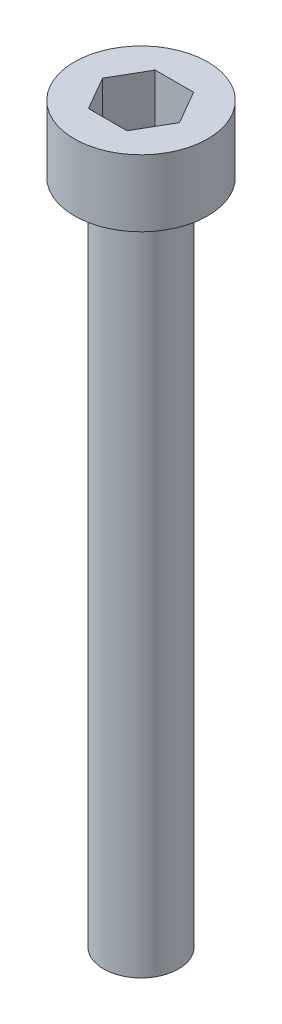
ISO-10303-21;
HEADER;
FILE_DESCRIPTION(('STEP AP214'),'2;1');
FILE_NAME('part.step','',(''),(''),'','','');
FILE_SCHEMA(('AUTOMOTIVE_DESIGN { 1 0 10303 214 1 1 1 1 }'));
ENDSEC;
DATA;
#1=APPLICATION_CONTEXT('core data for automotive mechanical design processes');
#2=APPLICATION_PROTOCOL_DEFINITION('international standard','automotive_design',2000,#1);
#3=PRODUCT_CONTEXT('',#1,'mechanical');
#4=PRODUCT('Part','Part','',(#3));
#5=PRODUCT_RELATED_PRODUCT_CATEGORY('part','',(#4));
#6=PRODUCT_DEFINITION_FORMATION('','',#4);
#7=PRODUCT_DEFINITION_CONTEXT('part definition',#1,'design');
#8=PRODUCT_DEFINITION('design','',#6,#7);
#9=PRODUCT_DEFINITION_SHAPE('','',#8);
#10=(LENGTH_UNIT() NAMED_UNIT(*) SI_UNIT(.MILLI.,.METRE.));
#11=(NAMED_UNIT(*) PLANE_ANGLE_UNIT() SI_UNIT($,.RADIAN.));
#12=(NAMED_UNIT(*) SI_UNIT($,.STERADIAN.) SOLID_ANGLE_UNIT());
#13=UNCERTAINTY_MEASURE_WITH_UNIT(LENGTH_MEASURE(1.E-05),#10,'distance_accuracy_value','');
#14=(GEOMETRIC_REPRESENTATION_CONTEXT(3) GLOBAL_UNCERTAINTY_ASSIGNED_CONTEXT((#13)) GLOBAL_UNIT_ASSIGNED_CONTEXT((#10,
#11,#12)) REPRESENTATION_CONTEXT('',''));
#15=CARTESIAN_POINT('',(0.,0.,0.));
#16=DIRECTION('',(0.,0.,1.));
#17=DIRECTION('',(1.,0.,0.));
#18=AXIS2_PLACEMENT_3D('',#15,#16,#17);
#19=CARTESIAN_POINT('',(0.,-20.,0.));
#20=DIRECTION('',(0.,1.,0.));
#21=DIRECTION('',(0.,0.,1.));
#22=AXIS2_PLACEMENT_3D('',#19,#20,#21);
#23=PLANE('',#22);
#24=CARTESIAN_POINT('',(1.125,-20.,0.));
#25=DIRECTION('',(0.,-1.,0.));
#26=DIRECTION('',(0.,0.,-1.));
#27=AXIS2_PLACEMENT_3D('',#24,#25,#26);
#28=CIRCLE('',#27,2.25);
#29=CARTESIAN_POINT('',(1.125,-20.,-2.25));
#30=VERTEX_POINT('',#29);
#31=EDGE_CURVE('E142',#30,#30,#28,.T.);
#32=ORIENTED_EDGE('',*,*,#31,.T.);
#33=EDGE_LOOP('',(#32));
#34=FACE_BOUND('',#33,.T.);
#35=ADVANCED_FACE('F41',(#34),#23,.F.);
#36=CARTESIAN_POINT('',(0.,24.,0.));
#37=DIRECTION('',(0.,-1.,0.));
#38=DIRECTION('',(0.,0.,-1.));
#39=AXIS2_PLACEMENT_3D('',#36,#37,#38);
#40=PLANE('',#39);
#41=DIRECTION('',(-0.5,0.,-0.866025403784439));
#42=VECTOR('',#41,1.);
#43=CARTESIAN_POINT('',(3.4344010767585,24.,0.));
#44=LINE('',#43,#42);
#45=CARTESIAN_POINT('',(3.4344010767585,24.,0.));
#46=VERTEX_POINT('',#45);
#47=CARTESIAN_POINT('',(2.27970053837925,24.,-2.));
#48=VERTEX_POINT('',#47);
#49=EDGE_CURVE('E129',#46,#48,#44,.T.);
#50=ORIENTED_EDGE('',*,*,#49,.F.);
#51=DIRECTION('',(0.5,0.,-0.866025403784439));
#52=VECTOR('',#51,1.);
#53=CARTESIAN_POINT('',(2.27970053837925,24.,2.));
#54=LINE('',#53,#52);
#55=CARTESIAN_POINT('',(2.27970053837925,24.,2.));
#56=VERTEX_POINT('',#55);
#57=EDGE_CURVE('E55',#56,#46,#54,.T.);
#58=ORIENTED_EDGE('',*,*,#57,.F.);
#59=DIRECTION('',(1.,0.,0.));
#60=VECTOR('',#59,1.);
#61=CARTESIAN_POINT('',(-0.0297005383792518,24.,2.));
#62=LINE('',#61,#60);
#63=CARTESIAN_POINT('',(-0.0297005383792518,24.,2.));
#64=VERTEX_POINT('',#63);
#65=EDGE_CURVE('E138',#64,#56,#62,.T.);
#66=ORIENTED_EDGE('',*,*,#65,.F.);
#67=DIRECTION('',(0.5,0.,0.866025403784439));
#68=VECTOR('',#67,1.);
#69=CARTESIAN_POINT('',(-1.1844010767585,24.,0.));
#70=LINE('',#69,#68);
#71=CARTESIAN_POINT('',(-1.1844010767585,24.,0.));
#72=VERTEX_POINT('',#71);
#73=EDGE_CURVE('E136',#72,#64,#70,.T.);
#74=ORIENTED_EDGE('',*,*,#73,.F.);
#75=DIRECTION('',(-0.5,0.,0.866025403784439));
#76=VECTOR('',#75,1.);
#77=CARTESIAN_POINT('',(-0.0297005383792528,24.,-2.));
#78=LINE('',#77,#76);
#79=CARTESIAN_POINT('',(-0.0297005383792528,24.,-2.));
#80=VERTEX_POINT('',#79);
#81=EDGE_CURVE('E103',#80,#72,#78,.T.);
#82=ORIENTED_EDGE('',*,*,#81,.F.);
#83=DIRECTION('',(-1.,0.,0.));
#84=VECTOR('',#83,1.);
#85=CARTESIAN_POINT('',(2.27970053837925,24.,-2.));
#86=LINE('',#85,#84);
#87=EDGE_CURVE('E132',#48,#80,#86,.T.);
#88=ORIENTED_EDGE('',*,*,#87,.F.);
#89=EDGE_LOOP('',(#50,#58,#66,#74,#82,#88));
#90=FACE_BOUND('',#89,.T.);
#91=CARTESIAN_POINT('',(1.125,24.,0.));
#92=DIRECTION('',(0.,-1.,0.));
#93=DIRECTION('',(0.,0.,-1.));
#94=AXIS2_PLACEMENT_3D('',#91,#92,#93);
#95=CIRCLE('',#94,4.);
#96=CARTESIAN_POINT('',(1.125,24.,-4.));
#97=VERTEX_POINT('',#96);
#98=EDGE_CURVE('E11',#97,#97,#95,.T.);
#99=ORIENTED_EDGE('',*,*,#98,.F.);
#100=EDGE_LOOP('',(#99));
#101=FACE_BOUND('',#100,.T.);
#102=ADVANCED_FACE('F160',(#90,#101),#40,.F.);
#103=CARTESIAN_POINT('',(1.125,-20.,0.));
#104=DIRECTION('',(0.,-1.,0.));
#105=DIRECTION('',(0.,0.,-1.));
#106=AXIS2_PLACEMENT_3D('',#103,#104,#105);
#107=CYLINDRICAL_SURFACE('',#106,4.);
#108=ORIENTED_EDGE('',*,*,#98,.T.);
#109=EDGE_LOOP('',(#108));
#110=FACE_BOUND('',#109,.T.);
#111=CARTESIAN_POINT('',(1.125,20.,0.));
#112=DIRECTION('',(0.,-1.,0.));
#113=DIRECTION('',(0.,0.,-1.));
#114=AXIS2_PLACEMENT_3D('',#111,#112,#113);
#115=CIRCLE('',#114,4.);
#116=CARTESIAN_POINT('',(1.125,20.,-4.));
#117=VERTEX_POINT('',#116);
#118=EDGE_CURVE('E48',#117,#117,#115,.T.);
#119=ORIENTED_EDGE('',*,*,#118,.F.);
#120=EDGE_LOOP('',(#119));
#121=FACE_BOUND('',#120,.T.);
#122=ADVANCED_FACE('F158',(#110,#121),#107,.T.);
#123=CARTESIAN_POINT('',(0.,20.,0.));
#124=DIRECTION('',(0.,-1.,0.));
#125=DIRECTION('',(0.,0.,-1.));
#126=AXIS2_PLACEMENT_3D('',#123,#124,#125);
#127=PLANE('',#126);
#128=ORIENTED_EDGE('',*,*,#118,.T.);
#129=EDGE_LOOP('',(#128));
#130=FACE_BOUND('',#129,.T.);
#131=CARTESIAN_POINT('',(1.125,20.,0.));
#132=DIRECTION('',(0.,-1.,0.));
#133=DIRECTION('',(0.,0.,-1.));
#134=AXIS2_PLACEMENT_3D('',#131,#132,#133);
#135=CIRCLE('',#134,2.25);
#136=CARTESIAN_POINT('',(1.125,20.,-2.25));
#137=VERTEX_POINT('',#136);
#138=EDGE_CURVE('E150',#137,#137,#135,.T.);
#139=ORIENTED_EDGE('',*,*,#138,.F.);
#140=EDGE_LOOP('',(#139));
#141=FACE_BOUND('',#140,.T.);
#142=ADVANCED_FACE('F155',(#130,#141),#127,.T.);
#143=CARTESIAN_POINT('',(1.125,-20.,0.));
#144=DIRECTION('',(0.,-1.,0.));
#145=DIRECTION('',(0.,0.,-1.));
#146=AXIS2_PLACEMENT_3D('',#143,#144,#145);
#147=CYLINDRICAL_SURFACE('',#146,2.25);
#148=ORIENTED_EDGE('',*,*,#138,.T.);
#149=EDGE_LOOP('',(#148));
#150=FACE_BOUND('',#149,.T.);
#151=ORIENTED_EDGE('',*,*,#31,.F.);
#152=EDGE_LOOP('',(#151));
#153=FACE_BOUND('',#152,.T.);
#154=ADVANCED_FACE('F167',(#150,#153),#147,.T.);
#155=CARTESIAN_POINT('',(2.27970053837925,21.,2.));
#156=DIRECTION('',(0.866025403784439,0.,0.5));
#157=DIRECTION('',(0.5,0.,-0.866025403784439));
#158=AXIS2_PLACEMENT_3D('',#155,#156,#157);
#159=PLANE('',#158);
#160=ORIENTED_EDGE('',*,*,#57,.T.);
#161=DIRECTION('',(0.,1.,0.));
#162=VECTOR('',#161,1.);
#163=CARTESIAN_POINT('',(3.4344010767585,21.,0.));
#164=LINE('',#163,#162);
#165=CARTESIAN_POINT('',(3.4344010767585,21.,0.));
#166=VERTEX_POINT('',#165);
#167=EDGE_CURVE('E85',#166,#46,#164,.T.);
#168=ORIENTED_EDGE('',*,*,#167,.F.);
#169=DIRECTION('',(0.5,0.,-0.866025403784439));
#170=VECTOR('',#169,1.);
#171=CARTESIAN_POINT('',(2.27970053837925,21.,2.));
#172=LINE('',#171,#170);
#173=CARTESIAN_POINT('',(2.27970053837925,21.,2.));
#174=VERTEX_POINT('',#173);
#175=EDGE_CURVE('E140',#174,#166,#172,.T.);
#176=ORIENTED_EDGE('',*,*,#175,.F.);
#177=DIRECTION('',(0.,1.,0.));
#178=VECTOR('',#177,1.);
#179=CARTESIAN_POINT('',(2.27970053837925,21.,2.));
#180=LINE('',#179,#178);
#181=EDGE_CURVE('E63',#174,#56,#180,.T.);
#182=ORIENTED_EDGE('',*,*,#181,.T.);
#183=EDGE_LOOP('',(#160,#168,#176,#182));
#184=FACE_BOUND('',#183,.T.);
#185=ADVANCED_FACE('F177',(#184),#159,.F.);
#186=CARTESIAN_POINT('',(-0.0297005383792517,21.,2.));
#187=DIRECTION('',(0.,0.,1.));
#188=DIRECTION('',(1.,0.,0.));
#189=AXIS2_PLACEMENT_3D('',#186,#187,#188);
#190=PLANE('',#189);
#191=ORIENTED_EDGE('',*,*,#65,.T.);
#192=ORIENTED_EDGE('',*,*,#181,.F.);
#193=DIRECTION('',(1.,0.,0.));
#194=VECTOR('',#193,1.);
#195=CARTESIAN_POINT('',(-0.0297005383792517,21.,2.));
#196=LINE('',#195,#194);
#197=CARTESIAN_POINT('',(-0.0297005383792517,21.,2.));
#198=VERTEX_POINT('',#197);
#199=EDGE_CURVE('E115',#198,#174,#196,.T.);
#200=ORIENTED_EDGE('',*,*,#199,.F.);
#201=DIRECTION('',(0.,1.,0.));
#202=VECTOR('',#201,1.);
#203=CARTESIAN_POINT('',(-0.0297005383792517,21.,2.));
#204=LINE('',#203,#202);
#205=EDGE_CURVE('E107',#198,#64,#204,.T.);
#206=ORIENTED_EDGE('',*,*,#205,.T.);
#207=EDGE_LOOP('',(#191,#192,#200,#206));
#208=FACE_BOUND('',#207,.T.);
#209=ADVANCED_FACE('F183',(#208),#190,.F.);
#210=CARTESIAN_POINT('',(-1.1844010767585,21.,0.));
#211=DIRECTION('',(-0.866025403784439,0.,0.5));
#212=DIRECTION('',(0.5,0.,0.866025403784439));
#213=AXIS2_PLACEMENT_3D('',#210,#211,#212);
#214=PLANE('',#213);
#215=ORIENTED_EDGE('',*,*,#73,.T.);
#216=ORIENTED_EDGE('',*,*,#205,.F.);
#217=DIRECTION('',(0.5,0.,0.866025403784439));
#218=VECTOR('',#217,1.);
#219=CARTESIAN_POINT('',(-1.1844010767585,21.,0.));
#220=LINE('',#219,#218);
#221=CARTESIAN_POINT('',(-1.1844010767585,21.,0.));
#222=VERTEX_POINT('',#221);
#223=EDGE_CURVE('E111',#222,#198,#220,.T.);
#224=ORIENTED_EDGE('',*,*,#223,.F.);
#225=DIRECTION('',(0.,1.,0.));
#226=VECTOR('',#225,1.);
#227=CARTESIAN_POINT('',(-1.1844010767585,21.,0.));
#228=LINE('',#227,#226);
#229=EDGE_CURVE('E96',#222,#72,#228,.T.);
#230=ORIENTED_EDGE('',*,*,#229,.T.);
#231=EDGE_LOOP('',(#215,#216,#224,#230));
#232=FACE_BOUND('',#231,.T.);
#233=ADVANCED_FACE('F112',(#232),#214,.F.);
#234=CARTESIAN_POINT('',(-0.0297005383792527,21.,-2.));
#235=DIRECTION('',(-0.866025403784439,0.,-0.5));
#236=DIRECTION('',(-0.5,0.,0.866025403784439));
#237=AXIS2_PLACEMENT_3D('',#234,#235,#236);
#238=PLANE('',#237);
#239=ORIENTED_EDGE('',*,*,#81,.T.);
#240=ORIENTED_EDGE('',*,*,#229,.F.);
#241=DIRECTION('',(-0.5,0.,0.866025403784439));
#242=VECTOR('',#241,1.);
#243=CARTESIAN_POINT('',(-0.0297005383792527,21.,-2.));
#244=LINE('',#243,#242);
#245=CARTESIAN_POINT('',(-0.0297005383792527,21.,-2.));
#246=VERTEX_POINT('',#245);
#247=EDGE_CURVE('E100',#246,#222,#244,.T.);
#248=ORIENTED_EDGE('',*,*,#247,.F.);
#249=DIRECTION('',(0.,1.,0.));
#250=VECTOR('',#249,1.);
#251=CARTESIAN_POINT('',(-0.0297005383792527,21.,-2.));
#252=LINE('',#251,#250);
#253=EDGE_CURVE('E108',#246,#80,#252,.T.);
#254=ORIENTED_EDGE('',*,*,#253,.T.);
#255=EDGE_LOOP('',(#239,#240,#248,#254));
#256=FACE_BOUND('',#255,.T.);
#257=ADVANCED_FACE('F98',(#256),#238,.F.);
#258=CARTESIAN_POINT('',(2.27970053837925,21.,-2.));
#259=DIRECTION('',(0.,0.,-1.));
#260=DIRECTION('',(-1.,0.,0.));
#261=AXIS2_PLACEMENT_3D('',#258,#259,#260);
#262=PLANE('',#261);
#263=ORIENTED_EDGE('',*,*,#87,.T.);
#264=ORIENTED_EDGE('',*,*,#253,.F.);
#265=DIRECTION('',(-1.,0.,0.));
#266=VECTOR('',#265,1.);
#267=CARTESIAN_POINT('',(2.27970053837925,21.,-2.));
#268=LINE('',#267,#266);
#269=CARTESIAN_POINT('',(2.27970053837925,21.,-2.));
#270=VERTEX_POINT('',#269);
#271=EDGE_CURVE('E121',#270,#246,#268,.T.);
#272=ORIENTED_EDGE('',*,*,#271,.F.);
#273=DIRECTION('',(0.,1.,0.));
#274=VECTOR('',#273,1.);
#275=CARTESIAN_POINT('',(2.27970053837925,21.,-2.));
#276=LINE('',#275,#274);
#277=EDGE_CURVE('E145',#270,#48,#276,.T.);
#278=ORIENTED_EDGE('',*,*,#277,.T.);
#279=EDGE_LOOP('',(#263,#264,#272,#278));
#280=FACE_BOUND('',#279,.T.);
#281=ADVANCED_FACE('F189',(#280),#262,.F.);
#282=CARTESIAN_POINT('',(3.4344010767585,21.,0.));
#283=DIRECTION('',(0.866025403784439,0.,-0.5));
#284=DIRECTION('',(-0.5,0.,-0.866025403784439));
#285=AXIS2_PLACEMENT_3D('',#282,#283,#284);
#286=PLANE('',#285);
#287=ORIENTED_EDGE('',*,*,#49,.T.);
#288=ORIENTED_EDGE('',*,*,#277,.F.);
#289=DIRECTION('',(-0.5,0.,-0.866025403784439));
#290=VECTOR('',#289,1.);
#291=CARTESIAN_POINT('',(3.4344010767585,21.,0.));
#292=LINE('',#291,#290);
#293=EDGE_CURVE('E123',#166,#270,#292,.T.);
#294=ORIENTED_EDGE('',*,*,#293,.F.);
#295=ORIENTED_EDGE('',*,*,#167,.T.);
#296=EDGE_LOOP('',(#287,#288,#294,#295));
#297=FACE_BOUND('',#296,.T.);
#298=ADVANCED_FACE('F186',(#297),#286,.F.);
#299=CARTESIAN_POINT('',(0.,21.,0.));
#300=DIRECTION('',(0.,1.,0.));
#301=DIRECTION('',(0.,0.,1.));
#302=AXIS2_PLACEMENT_3D('',#299,#300,#301);
#303=PLANE('',#302);
#304=ORIENTED_EDGE('',*,*,#175,.T.);
#305=ORIENTED_EDGE('',*,*,#293,.T.);
#306=ORIENTED_EDGE('',*,*,#271,.T.);
#307=ORIENTED_EDGE('',*,*,#247,.T.);
#308=ORIENTED_EDGE('',*,*,#223,.T.);
#309=ORIENTED_EDGE('',*,*,#199,.T.);
#310=EDGE_LOOP('',(#304,#305,#306,#307,#308,#309));
#311=FACE_BOUND('',#310,.T.);
#312=ADVANCED_FACE('F118',(#311),#303,.T.);
#313=CLOSED_SHELL('',(#35,#102,#122,#142,#154,#185,#209,#233,#257,#281,#298,#312));
#314=MANIFOLD_SOLID_BREP('B2',#313);
#315=ADVANCED_BREP_SHAPE_REPRESENTATION('',(#18,#314),#14);
#316=SHAPE_DEFINITION_REPRESENTATION(#9,#315);
ENDSEC;
END-ISO-10303-21;
